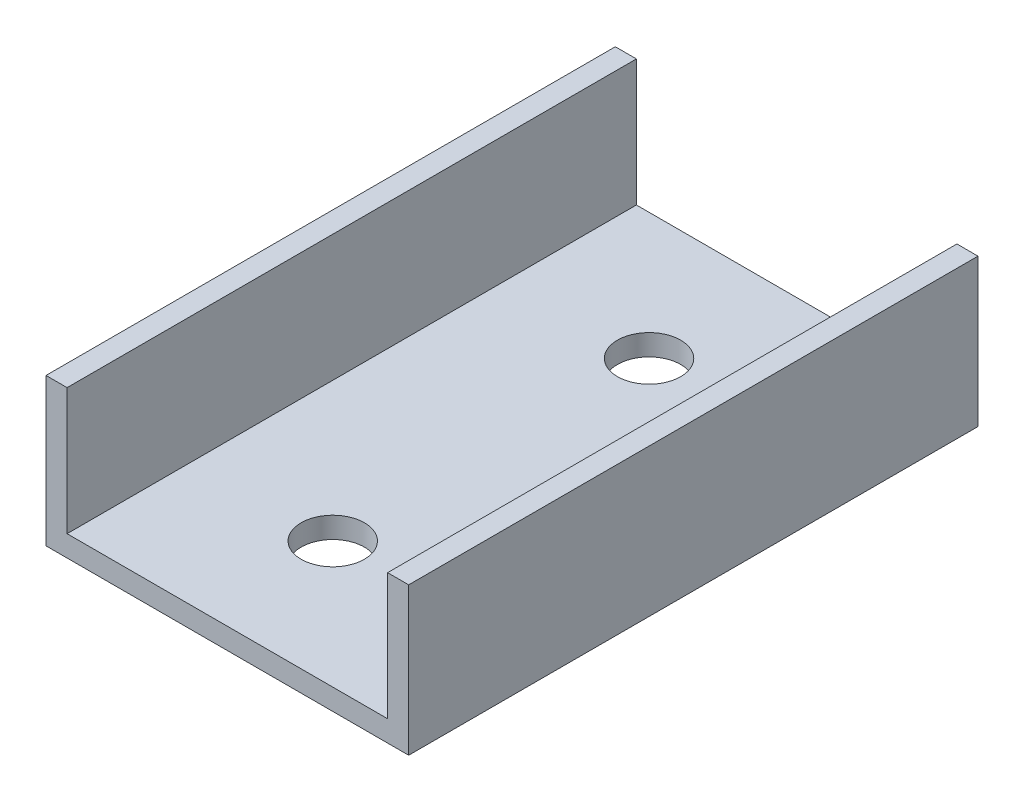
ISO-10303-21;
HEADER;
FILE_DESCRIPTION(('STEP AP214'),'2;1');
FILE_NAME('part.step','',(''),(''),'','','');
FILE_SCHEMA(('AUTOMOTIVE_DESIGN { 1 0 10303 214 1 1 1 1 }'));
ENDSEC;
DATA;
#1=APPLICATION_CONTEXT('core data for automotive mechanical design processes');
#2=APPLICATION_PROTOCOL_DEFINITION('international standard','automotive_design',2000,#1);
#3=PRODUCT_CONTEXT('',#1,'mechanical');
#4=PRODUCT('Part','Part','',(#3));
#5=PRODUCT_RELATED_PRODUCT_CATEGORY('part','',(#4));
#6=PRODUCT_DEFINITION_FORMATION('','',#4);
#7=PRODUCT_DEFINITION_CONTEXT('part definition',#1,'design');
#8=PRODUCT_DEFINITION('design','',#6,#7);
#9=PRODUCT_DEFINITION_SHAPE('','',#8);
#10=(LENGTH_UNIT() NAMED_UNIT(*) SI_UNIT(.MILLI.,.METRE.));
#11=(NAMED_UNIT(*) PLANE_ANGLE_UNIT() SI_UNIT($,.RADIAN.));
#12=(NAMED_UNIT(*) SI_UNIT($,.STERADIAN.) SOLID_ANGLE_UNIT());
#13=UNCERTAINTY_MEASURE_WITH_UNIT(LENGTH_MEASURE(1.E-05),#10,'distance_accuracy_value','');
#14=(GEOMETRIC_REPRESENTATION_CONTEXT(3) GLOBAL_UNCERTAINTY_ASSIGNED_CONTEXT((#13)) GLOBAL_UNIT_ASSIGNED_CONTEXT((#10,
#11,#12)) REPRESENTATION_CONTEXT('',''));
#15=CARTESIAN_POINT('',(0.,0.,0.));
#16=DIRECTION('',(0.,0.,1.));
#17=DIRECTION('',(1.,0.,0.));
#18=AXIS2_PLACEMENT_3D('',#15,#16,#17);
#19=CARTESIAN_POINT('',(-7.6,0.,27.));
#20=DIRECTION('',(-1.,0.,0.));
#21=DIRECTION('',(0.,0.,1.));
#22=AXIS2_PLACEMENT_3D('',#19,#20,#21);
#23=PLANE('',#22);
#24=DIRECTION('',(0.,1.,0.));
#25=VECTOR('',#24,1.);
#26=CARTESIAN_POINT('',(-7.6,0.,0.));
#27=LINE('',#26,#25);
#28=CARTESIAN_POINT('',(-7.6,1.,0.));
#29=VERTEX_POINT('',#28);
#30=CARTESIAN_POINT('',(-7.6,7.,0.));
#31=VERTEX_POINT('',#30);
#32=EDGE_CURVE('E134',#29,#31,#27,.T.);
#33=ORIENTED_EDGE('',*,*,#32,.T.);
#34=DIRECTION('',(0.,0.,-1.));
#35=VECTOR('',#34,1.);
#36=CARTESIAN_POINT('',(-7.6,7.,27.));
#37=LINE('',#36,#35);
#38=CARTESIAN_POINT('',(-7.6,7.,27.));
#39=VERTEX_POINT('',#38);
#40=EDGE_CURVE('E11',#39,#31,#37,.T.);
#41=ORIENTED_EDGE('',*,*,#40,.F.);
#42=DIRECTION('',(0.,1.,0.));
#43=VECTOR('',#42,1.);
#44=CARTESIAN_POINT('',(-7.6,0.,27.));
#45=LINE('',#44,#43);
#46=CARTESIAN_POINT('',(-7.6,1.,27.));
#47=VERTEX_POINT('',#46);
#48=EDGE_CURVE('E149',#47,#39,#45,.T.);
#49=ORIENTED_EDGE('',*,*,#48,.F.);
#50=DIRECTION('',(0.,0.,-1.));
#51=VECTOR('',#50,1.);
#52=CARTESIAN_POINT('',(-7.6,1.,27.));
#53=LINE('',#52,#51);
#54=EDGE_CURVE('E130',#47,#29,#53,.T.);
#55=ORIENTED_EDGE('',*,*,#54,.T.);
#56=EDGE_LOOP('',(#33,#41,#49,#55));
#57=FACE_BOUND('',#56,.T.);
#58=ADVANCED_FACE('F38',(#57),#23,.F.);
#59=CARTESIAN_POINT('',(0.,7.00000000000001,27.));
#60=DIRECTION('',(0.,-1.,0.));
#61=DIRECTION('',(1.,0.,0.));
#62=AXIS2_PLACEMENT_3D('',#59,#60,#61);
#63=PLANE('',#62);
#64=DIRECTION('',(-1.,0.,0.));
#65=VECTOR('',#64,1.);
#66=CARTESIAN_POINT('',(0.,7.00000000000001,0.));
#67=LINE('',#66,#65);
#68=CARTESIAN_POINT('',(-8.6,7.,0.));
#69=VERTEX_POINT('',#68);
#70=EDGE_CURVE('E137',#31,#69,#67,.T.);
#71=ORIENTED_EDGE('',*,*,#70,.T.);
#72=DIRECTION('',(0.,0.,-1.));
#73=VECTOR('',#72,1.);
#74=CARTESIAN_POINT('',(-8.6,7.,27.));
#75=LINE('',#74,#73);
#76=CARTESIAN_POINT('',(-8.6,7.,27.));
#77=VERTEX_POINT('',#76);
#78=EDGE_CURVE('E46',#77,#69,#75,.T.);
#79=ORIENTED_EDGE('',*,*,#78,.F.);
#80=DIRECTION('',(-1.,0.,0.));
#81=VECTOR('',#80,1.);
#82=CARTESIAN_POINT('',(0.,7.00000000000001,27.));
#83=LINE('',#82,#81);
#84=EDGE_CURVE('E97',#39,#77,#83,.T.);
#85=ORIENTED_EDGE('',*,*,#84,.F.);
#86=ORIENTED_EDGE('',*,*,#40,.T.);
#87=EDGE_LOOP('',(#71,#79,#85,#86));
#88=FACE_BOUND('',#87,.T.);
#89=ADVANCED_FACE('F219',(#88),#63,.F.);
#90=CARTESIAN_POINT('',(-8.6,0.,27.));
#91=DIRECTION('',(1.,0.,0.));
#92=DIRECTION('',(0.,1.,0.));
#93=AXIS2_PLACEMENT_3D('',#90,#91,#92);
#94=PLANE('',#93);
#95=DIRECTION('',(0.,-1.,0.));
#96=VECTOR('',#95,1.);
#97=CARTESIAN_POINT('',(-8.6,0.,0.));
#98=LINE('',#97,#96);
#99=CARTESIAN_POINT('',(-8.6,0.,0.));
#100=VERTEX_POINT('',#99);
#101=EDGE_CURVE('E140',#69,#100,#98,.T.);
#102=ORIENTED_EDGE('',*,*,#101,.T.);
#103=DIRECTION('',(0.,0.,-1.));
#104=VECTOR('',#103,1.);
#105=CARTESIAN_POINT('',(-8.6,0.,27.));
#106=LINE('',#105,#104);
#107=CARTESIAN_POINT('',(-8.6,0.,27.));
#108=VERTEX_POINT('',#107);
#109=EDGE_CURVE('E156',#108,#100,#106,.T.);
#110=ORIENTED_EDGE('',*,*,#109,.F.);
#111=DIRECTION('',(0.,-1.,0.));
#112=VECTOR('',#111,1.);
#113=CARTESIAN_POINT('',(-8.6,0.,27.));
#114=LINE('',#113,#112);
#115=EDGE_CURVE('E164',#77,#108,#114,.T.);
#116=ORIENTED_EDGE('',*,*,#115,.F.);
#117=ORIENTED_EDGE('',*,*,#78,.T.);
#118=EDGE_LOOP('',(#102,#110,#116,#117));
#119=FACE_BOUND('',#118,.T.);
#120=ADVANCED_FACE('F162',(#119),#94,.F.);
#121=CARTESIAN_POINT('',(0.,0.,27.));
#122=DIRECTION('',(0.,1.,0.));
#123=DIRECTION('',(0.,0.,1.));
#124=AXIS2_PLACEMENT_3D('',#121,#122,#123);
#125=PLANE('',#124);
#126=CARTESIAN_POINT('',(-0.999999999999999,0.,6.));
#127=DIRECTION('',(0.,1.,0.));
#128=DIRECTION('',(0.,0.,1.));
#129=AXIS2_PLACEMENT_3D('',#126,#127,#128);
#130=CIRCLE('',#129,1.5);
#131=CARTESIAN_POINT('',(-0.999999999999999,0.,7.5));
#132=VERTEX_POINT('',#131);
#133=EDGE_CURVE('E138',#132,#132,#130,.T.);
#134=ORIENTED_EDGE('',*,*,#133,.T.);
#135=EDGE_LOOP('',(#134));
#136=FACE_BOUND('',#135,.T.);
#137=CARTESIAN_POINT('',(-0.999999999999998,0.,21.));
#138=DIRECTION('',(0.,1.,0.));
#139=DIRECTION('',(0.,0.,1.));
#140=AXIS2_PLACEMENT_3D('',#137,#138,#139);
#141=CIRCLE('',#140,1.5);
#142=CARTESIAN_POINT('',(-0.999999999999998,0.,22.5));
#143=VERTEX_POINT('',#142);
#144=EDGE_CURVE('E185',#143,#143,#141,.T.);
#145=ORIENTED_EDGE('',*,*,#144,.T.);
#146=EDGE_LOOP('',(#145));
#147=FACE_BOUND('',#146,.T.);
#148=DIRECTION('',(1.,0.,0.));
#149=VECTOR('',#148,1.);
#150=CARTESIAN_POINT('',(0.,0.,0.));
#151=LINE('',#150,#149);
#152=CARTESIAN_POINT('',(8.6,0.,0.));
#153=VERTEX_POINT('',#152);
#154=EDGE_CURVE('E142',#100,#153,#151,.T.);
#155=ORIENTED_EDGE('',*,*,#154,.T.);
#156=DIRECTION('',(0.,0.,-1.));
#157=VECTOR('',#156,1.);
#158=CARTESIAN_POINT('',(8.6,0.,27.));
#159=LINE('',#158,#157);
#160=CARTESIAN_POINT('',(8.6,0.,27.));
#161=VERTEX_POINT('',#160);
#162=EDGE_CURVE('E153',#161,#153,#159,.T.);
#163=ORIENTED_EDGE('',*,*,#162,.F.);
#164=DIRECTION('',(1.,0.,0.));
#165=VECTOR('',#164,1.);
#166=CARTESIAN_POINT('',(0.,0.,27.));
#167=LINE('',#166,#165);
#168=EDGE_CURVE('E176',#108,#161,#167,.T.);
#169=ORIENTED_EDGE('',*,*,#168,.F.);
#170=ORIENTED_EDGE('',*,*,#109,.T.);
#171=EDGE_LOOP('',(#155,#163,#169,#170));
#172=FACE_BOUND('',#171,.T.);
#173=ADVANCED_FACE('F172',(#136,#147,#172),#125,.F.);
#174=CARTESIAN_POINT('',(8.6,0.,27.));
#175=DIRECTION('',(-1.,0.,0.));
#176=DIRECTION('',(0.,-1.,0.));
#177=AXIS2_PLACEMENT_3D('',#174,#175,#176);
#178=PLANE('',#177);
#179=DIRECTION('',(0.,1.,0.));
#180=VECTOR('',#179,1.);
#181=CARTESIAN_POINT('',(8.6,0.,0.));
#182=LINE('',#181,#180);
#183=CARTESIAN_POINT('',(8.6,7.,0.));
#184=VERTEX_POINT('',#183);
#185=EDGE_CURVE('E144',#153,#184,#182,.T.);
#186=ORIENTED_EDGE('',*,*,#185,.T.);
#187=DIRECTION('',(0.,0.,-1.));
#188=VECTOR('',#187,1.);
#189=CARTESIAN_POINT('',(8.6,7.,27.));
#190=LINE('',#189,#188);
#191=CARTESIAN_POINT('',(8.6,7.,27.));
#192=VERTEX_POINT('',#191);
#193=EDGE_CURVE('E125',#192,#184,#190,.T.);
#194=ORIENTED_EDGE('',*,*,#193,.F.);
#195=DIRECTION('',(0.,1.,0.));
#196=VECTOR('',#195,1.);
#197=CARTESIAN_POINT('',(8.6,0.,27.));
#198=LINE('',#197,#196);
#199=EDGE_CURVE('E116',#161,#192,#198,.T.);
#200=ORIENTED_EDGE('',*,*,#199,.F.);
#201=ORIENTED_EDGE('',*,*,#162,.T.);
#202=EDGE_LOOP('',(#186,#194,#200,#201));
#203=FACE_BOUND('',#202,.T.);
#204=ADVANCED_FACE('F175',(#203),#178,.F.);
#205=CARTESIAN_POINT('',(0.,7.00000000000001,27.));
#206=DIRECTION('',(0.,-1.,0.));
#207=DIRECTION('',(1.,0.,0.));
#208=AXIS2_PLACEMENT_3D('',#205,#206,#207);
#209=PLANE('',#208);
#210=DIRECTION('',(-1.,0.,0.));
#211=VECTOR('',#210,1.);
#212=CARTESIAN_POINT('',(0.,7.00000000000001,0.));
#213=LINE('',#212,#211);
#214=CARTESIAN_POINT('',(7.6,7.,0.));
#215=VERTEX_POINT('',#214);
#216=EDGE_CURVE('E124',#184,#215,#213,.T.);
#217=ORIENTED_EDGE('',*,*,#216,.T.);
#218=DIRECTION('',(0.,0.,-1.));
#219=VECTOR('',#218,1.);
#220=CARTESIAN_POINT('',(7.6,7.,27.));
#221=LINE('',#220,#219);
#222=CARTESIAN_POINT('',(7.6,7.,27.));
#223=VERTEX_POINT('',#222);
#224=EDGE_CURVE('E121',#223,#215,#221,.T.);
#225=ORIENTED_EDGE('',*,*,#224,.F.);
#226=DIRECTION('',(-1.,0.,0.));
#227=VECTOR('',#226,1.);
#228=CARTESIAN_POINT('',(0.,7.00000000000001,27.));
#229=LINE('',#228,#227);
#230=EDGE_CURVE('E110',#192,#223,#229,.T.);
#231=ORIENTED_EDGE('',*,*,#230,.F.);
#232=ORIENTED_EDGE('',*,*,#193,.T.);
#233=EDGE_LOOP('',(#217,#225,#231,#232));
#234=FACE_BOUND('',#233,.T.);
#235=ADVANCED_FACE('F122',(#234),#209,.F.);
#236=CARTESIAN_POINT('',(7.6,0.,27.));
#237=DIRECTION('',(1.,0.,0.));
#238=DIRECTION('',(0.,0.,-1.));
#239=AXIS2_PLACEMENT_3D('',#236,#237,#238);
#240=PLANE('',#239);
#241=DIRECTION('',(0.,-1.,0.));
#242=VECTOR('',#241,1.);
#243=CARTESIAN_POINT('',(7.6,0.,0.));
#244=LINE('',#243,#242);
#245=CARTESIAN_POINT('',(7.6,1.,0.));
#246=VERTEX_POINT('',#245);
#247=EDGE_CURVE('E83',#215,#246,#244,.T.);
#248=ORIENTED_EDGE('',*,*,#247,.T.);
#249=DIRECTION('',(0.,0.,-1.));
#250=VECTOR('',#249,1.);
#251=CARTESIAN_POINT('',(7.6,1.,27.));
#252=LINE('',#251,#250);
#253=CARTESIAN_POINT('',(7.6,1.,27.));
#254=VERTEX_POINT('',#253);
#255=EDGE_CURVE('E126',#254,#246,#252,.T.);
#256=ORIENTED_EDGE('',*,*,#255,.F.);
#257=DIRECTION('',(0.,-1.,0.));
#258=VECTOR('',#257,1.);
#259=CARTESIAN_POINT('',(7.6,0.,27.));
#260=LINE('',#259,#258);
#261=EDGE_CURVE('E114',#223,#254,#260,.T.);
#262=ORIENTED_EDGE('',*,*,#261,.F.);
#263=ORIENTED_EDGE('',*,*,#224,.T.);
#264=EDGE_LOOP('',(#248,#256,#262,#263));
#265=FACE_BOUND('',#264,.T.);
#266=ADVANCED_FACE('F128',(#265),#240,.F.);
#267=CARTESIAN_POINT('',(0.,1.,27.));
#268=DIRECTION('',(0.,-1.,0.));
#269=DIRECTION('',(0.,0.,-1.));
#270=AXIS2_PLACEMENT_3D('',#267,#268,#269);
#271=PLANE('',#270);
#272=CARTESIAN_POINT('',(-0.999999999999999,1.,6.));
#273=DIRECTION('',(0.,1.,0.));
#274=DIRECTION('',(0.,0.,1.));
#275=AXIS2_PLACEMENT_3D('',#272,#273,#274);
#276=CIRCLE('',#275,1.5);
#277=CARTESIAN_POINT('',(-0.999999999999999,1.,7.5));
#278=VERTEX_POINT('',#277);
#279=EDGE_CURVE('E188',#278,#278,#276,.T.);
#280=ORIENTED_EDGE('',*,*,#279,.F.);
#281=EDGE_LOOP('',(#280));
#282=FACE_BOUND('',#281,.T.);
#283=CARTESIAN_POINT('',(-0.999999999999998,1.,21.));
#284=DIRECTION('',(0.,1.,0.));
#285=DIRECTION('',(0.,0.,1.));
#286=AXIS2_PLACEMENT_3D('',#283,#284,#285);
#287=CIRCLE('',#286,1.5);
#288=CARTESIAN_POINT('',(-0.999999999999998,1.,22.5));
#289=VERTEX_POINT('',#288);
#290=EDGE_CURVE('E182',#289,#289,#287,.T.);
#291=ORIENTED_EDGE('',*,*,#290,.F.);
#292=EDGE_LOOP('',(#291));
#293=FACE_BOUND('',#292,.T.);
#294=DIRECTION('',(-1.,0.,0.));
#295=VECTOR('',#294,1.);
#296=CARTESIAN_POINT('',(0.,1.,0.));
#297=LINE('',#296,#295);
#298=EDGE_CURVE('E89',#246,#29,#297,.T.);
#299=ORIENTED_EDGE('',*,*,#298,.T.);
#300=ORIENTED_EDGE('',*,*,#54,.F.);
#301=DIRECTION('',(-1.,0.,0.));
#302=VECTOR('',#301,1.);
#303=CARTESIAN_POINT('',(0.,1.,27.));
#304=LINE('',#303,#302);
#305=EDGE_CURVE('E54',#254,#47,#304,.T.);
#306=ORIENTED_EDGE('',*,*,#305,.F.);
#307=ORIENTED_EDGE('',*,*,#255,.T.);
#308=EDGE_LOOP('',(#299,#300,#306,#307));
#309=FACE_BOUND('',#308,.T.);
#310=ADVANCED_FACE('F203',(#282,#293,#309),#271,.F.);
#311=CARTESIAN_POINT('',(0.,0.,27.));
#312=DIRECTION('',(0.,0.,1.));
#313=DIRECTION('',(1.,0.,0.));
#314=AXIS2_PLACEMENT_3D('',#311,#312,#313);
#315=PLANE('',#314);
#316=ORIENTED_EDGE('',*,*,#48,.T.);
#317=ORIENTED_EDGE('',*,*,#84,.T.);
#318=ORIENTED_EDGE('',*,*,#115,.T.);
#319=ORIENTED_EDGE('',*,*,#168,.T.);
#320=ORIENTED_EDGE('',*,*,#199,.T.);
#321=ORIENTED_EDGE('',*,*,#230,.T.);
#322=ORIENTED_EDGE('',*,*,#261,.T.);
#323=ORIENTED_EDGE('',*,*,#305,.T.);
#324=EDGE_LOOP('',(#316,#317,#318,#319,#320,#321,#322,#323));
#325=FACE_BOUND('',#324,.T.);
#326=ADVANCED_FACE('F112',(#325),#315,.T.);
#327=CARTESIAN_POINT('',(0.,0.,0.));
#328=DIRECTION('',(0.,0.,1.));
#329=DIRECTION('',(1.,0.,0.));
#330=AXIS2_PLACEMENT_3D('',#327,#328,#329);
#331=PLANE('',#330);
#332=ORIENTED_EDGE('',*,*,#32,.F.);
#333=ORIENTED_EDGE('',*,*,#298,.F.);
#334=ORIENTED_EDGE('',*,*,#247,.F.);
#335=ORIENTED_EDGE('',*,*,#216,.F.);
#336=ORIENTED_EDGE('',*,*,#185,.F.);
#337=ORIENTED_EDGE('',*,*,#154,.F.);
#338=ORIENTED_EDGE('',*,*,#101,.F.);
#339=ORIENTED_EDGE('',*,*,#70,.F.);
#340=EDGE_LOOP('',(#332,#333,#334,#335,#336,#337,#338,#339));
#341=FACE_BOUND('',#340,.T.);
#342=ADVANCED_FACE('F168',(#341),#331,.F.);
#343=CARTESIAN_POINT('',(-0.999999999999998,0.,21.));
#344=DIRECTION('',(0.,1.,0.));
#345=DIRECTION('',(0.,0.,1.));
#346=AXIS2_PLACEMENT_3D('',#343,#344,#345);
#347=CYLINDRICAL_SURFACE('',#346,1.5);
#348=ORIENTED_EDGE('',*,*,#144,.F.);
#349=EDGE_LOOP('',(#348));
#350=FACE_BOUND('',#349,.T.);
#351=ORIENTED_EDGE('',*,*,#290,.T.);
#352=EDGE_LOOP('',(#351));
#353=FACE_BOUND('',#352,.T.);
#354=ADVANCED_FACE('F199',(#350,#353),#347,.F.);
#355=CARTESIAN_POINT('',(-0.999999999999999,0.,6.));
#356=DIRECTION('',(0.,1.,0.));
#357=DIRECTION('',(0.,0.,1.));
#358=AXIS2_PLACEMENT_3D('',#355,#356,#357);
#359=CYLINDRICAL_SURFACE('',#358,1.5);
#360=ORIENTED_EDGE('',*,*,#133,.F.);
#361=EDGE_LOOP('',(#360));
#362=FACE_BOUND('',#361,.T.);
#363=ORIENTED_EDGE('',*,*,#279,.T.);
#364=EDGE_LOOP('',(#363));
#365=FACE_BOUND('',#364,.T.);
#366=ADVANCED_FACE('F196',(#362,#365),#359,.F.);
#367=CLOSED_SHELL('',(#58,#89,#120,#173,#204,#235,#266,#310,#326,#342,#354,#366));
#368=MANIFOLD_SOLID_BREP('B2',#367);
#369=ADVANCED_BREP_SHAPE_REPRESENTATION('',(#18,#368),#14);
#370=SHAPE_DEFINITION_REPRESENTATION(#9,#369);
ENDSEC;
END-ISO-10303-21;
